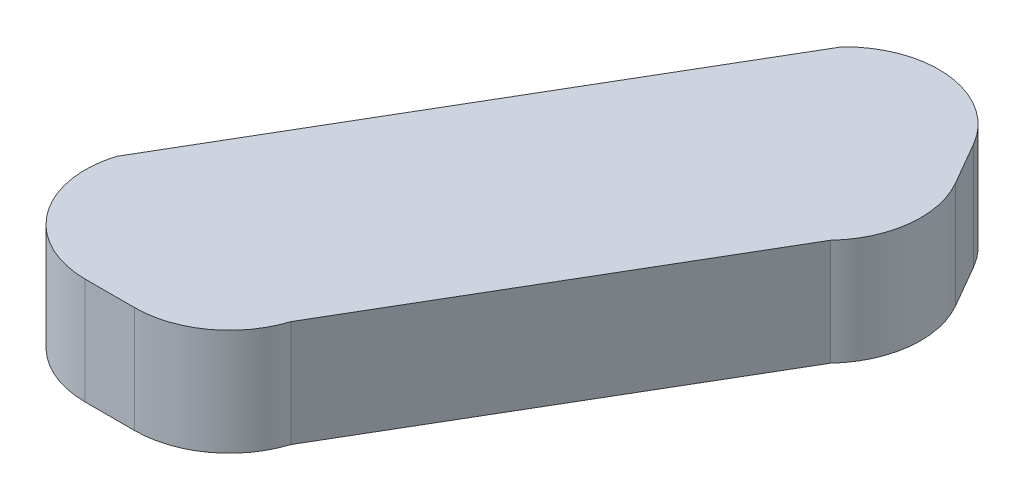
ISO-10303-21;
HEADER;
FILE_DESCRIPTION(('STEP AP214'),'2;1');
FILE_NAME('part.step','',(''),(''),'','','');
FILE_SCHEMA(('AUTOMOTIVE_DESIGN { 1 0 10303 214 1 1 1 1 }'));
ENDSEC;
DATA;
#1=APPLICATION_CONTEXT('core data for automotive mechanical design processes');
#2=APPLICATION_PROTOCOL_DEFINITION('international standard','automotive_design',2000,#1);
#3=PRODUCT_CONTEXT('',#1,'mechanical');
#4=PRODUCT('Part','Part','',(#3));
#5=PRODUCT_RELATED_PRODUCT_CATEGORY('part','',(#4));
#6=PRODUCT_DEFINITION_FORMATION('','',#4);
#7=PRODUCT_DEFINITION_CONTEXT('part definition',#1,'design');
#8=PRODUCT_DEFINITION('design','',#6,#7);
#9=PRODUCT_DEFINITION_SHAPE('','',#8);
#10=(LENGTH_UNIT() NAMED_UNIT(*) SI_UNIT(.MILLI.,.METRE.));
#11=(NAMED_UNIT(*) PLANE_ANGLE_UNIT() SI_UNIT($,.RADIAN.));
#12=(NAMED_UNIT(*) SI_UNIT($,.STERADIAN.) SOLID_ANGLE_UNIT());
#13=UNCERTAINTY_MEASURE_WITH_UNIT(LENGTH_MEASURE(1.E-05),#10,'distance_accuracy_value','');
#14=(GEOMETRIC_REPRESENTATION_CONTEXT(3) GLOBAL_UNCERTAINTY_ASSIGNED_CONTEXT((#13)) GLOBAL_UNIT_ASSIGNED_CONTEXT((#10,
#11,#12)) REPRESENTATION_CONTEXT('',''));
#15=CARTESIAN_POINT('',(0.,0.,0.));
#16=DIRECTION('',(0.,0.,1.));
#17=DIRECTION('',(1.,0.,0.));
#18=AXIS2_PLACEMENT_3D('',#15,#16,#17);
#19=CARTESIAN_POINT('',(-62.5966892851256,4.5,-60.4206462274399));
#20=DIRECTION('',(0.,-1.,0.));
#21=DIRECTION('',(0.,0.,-1.));
#22=AXIS2_PLACEMENT_3D('',#19,#20,#21);
#23=CYLINDRICAL_SURFACE('',#22,8.);
#24=CARTESIAN_POINT('',(-62.5966892851256,-4.5,-60.4206462274399));
#25=DIRECTION('',(0.,1.,0.));
#26=DIRECTION('',(0.,0.,1.));
#27=AXIS2_PLACEMENT_3D('',#24,#25,#26);
#28=CIRCLE('',#27,8.);
#29=CARTESIAN_POINT('',(-55.66848605485,-4.5,-64.4206462274399));
#30=VERTEX_POINT('',#29);
#31=CARTESIAN_POINT('',(-68.3527066906543,-4.5,-65.9765677196183));
#32=VERTEX_POINT('',#31);
#33=EDGE_CURVE('E140',#30,#32,#28,.T.);
#34=ORIENTED_EDGE('',*,*,#33,.T.);
#35=DIRECTION('',(0.,-1.,0.));
#36=VECTOR('',#35,1.);
#37=CARTESIAN_POINT('',(-68.3527066906543,4.5,-65.9765677196183));
#38=LINE('',#37,#36);
#39=CARTESIAN_POINT('',(-68.3527066906543,4.5,-65.9765677196183));
#40=VERTEX_POINT('',#39);
#41=EDGE_CURVE('E11',#40,#32,#38,.T.);
#42=ORIENTED_EDGE('',*,*,#41,.F.);
#43=CARTESIAN_POINT('',(-62.5966892851256,4.5,-60.4206462274399));
#44=DIRECTION('',(0.,1.,0.));
#45=DIRECTION('',(0.,0.,1.));
#46=AXIS2_PLACEMENT_3D('',#43,#44,#45);
#47=CIRCLE('',#46,8.);
#48=CARTESIAN_POINT('',(-55.66848605485,4.5,-64.4206462274399));
#49=VERTEX_POINT('',#48);
#50=EDGE_CURVE('E162',#49,#40,#47,.T.);
#51=ORIENTED_EDGE('',*,*,#50,.F.);
#52=DIRECTION('',(0.,-1.,0.));
#53=VECTOR('',#52,1.);
#54=CARTESIAN_POINT('',(-55.66848605485,4.5,-64.4206462274399));
#55=LINE('',#54,#53);
#56=EDGE_CURVE('E136',#49,#30,#55,.T.);
#57=ORIENTED_EDGE('',*,*,#56,.T.);
#58=EDGE_LOOP('',(#34,#42,#51,#57));
#59=FACE_BOUND('',#58,.T.);
#60=ADVANCED_FACE('F39',(#59),#23,.T.);
#61=CARTESIAN_POINT('',(-68.3527066906543,4.5,-65.9765677196183));
#62=DIRECTION('',(0.863015101140833,0.,0.505178122252813));
#63=DIRECTION('',(0.505178122252813,0.,-0.863015101140833));
#64=AXIS2_PLACEMENT_3D('',#61,#62,#63);
#65=PLANE('',#64);
#66=DIRECTION('',(-0.505178122252813,0.,0.863015101140833));
#67=VECTOR('',#66,1.);
#68=CARTESIAN_POINT('',(-68.3527066906543,-4.5,-65.9765677196183));
#69=LINE('',#68,#67);
#70=CARTESIAN_POINT('',(-90.9932566583893,-4.5,-27.2988505747126));
#71=VERTEX_POINT('',#70);
#72=EDGE_CURVE('E144',#32,#71,#69,.T.);
#73=ORIENTED_EDGE('',*,*,#72,.T.);
#74=DIRECTION('',(0.,-1.,0.));
#75=VECTOR('',#74,1.);
#76=CARTESIAN_POINT('',(-90.9932566583893,4.5,-27.2988505747126));
#77=LINE('',#76,#75);
#78=CARTESIAN_POINT('',(-90.9932566583893,4.5,-27.2988505747126));
#79=VERTEX_POINT('',#78);
#80=EDGE_CURVE('E48',#79,#71,#77,.T.);
#81=ORIENTED_EDGE('',*,*,#80,.F.);
#82=DIRECTION('',(-0.505178122252813,0.,0.863015101140833));
#83=VECTOR('',#82,1.);
#84=CARTESIAN_POINT('',(-68.3527066906543,4.5,-65.9765677196183));
#85=LINE('',#84,#83);
#86=EDGE_CURVE('E99',#40,#79,#85,.T.);
#87=ORIENTED_EDGE('',*,*,#86,.F.);
#88=ORIENTED_EDGE('',*,*,#41,.T.);
#89=EDGE_LOOP('',(#73,#81,#87,#88));
#90=FACE_BOUND('',#89,.T.);
#91=ADVANCED_FACE('F208',(#90),#65,.F.);
#92=CARTESIAN_POINT('',(-83.3306666239986,4.5,-25.));
#93=DIRECTION('',(0.,-1.,0.));
#94=DIRECTION('',(0.,0.,-1.));
#95=AXIS2_PLACEMENT_3D('',#92,#93,#94);
#96=CYLINDRICAL_SURFACE('',#95,8.);
#97=CARTESIAN_POINT('',(-83.3306666239986,-4.5,-25.));
#98=DIRECTION('',(0.,1.,0.));
#99=DIRECTION('',(0.,0.,-1.));
#100=AXIS2_PLACEMENT_3D('',#97,#98,#99);
#101=CIRCLE('',#100,8.);
#102=CARTESIAN_POINT('',(-83.3306666239987,-4.5,-17.));
#103=VERTEX_POINT('',#102);
#104=EDGE_CURVE('E147',#71,#103,#101,.T.);
#105=ORIENTED_EDGE('',*,*,#104,.T.);
#106=DIRECTION('',(0.,-1.,0.));
#107=VECTOR('',#106,1.);
#108=CARTESIAN_POINT('',(-83.3306666239987,4.5,-17.));
#109=LINE('',#108,#107);
#110=CARTESIAN_POINT('',(-83.3306666239987,4.5,-17.));
#111=VERTEX_POINT('',#110);
#112=EDGE_CURVE('E173',#111,#103,#109,.T.);
#113=ORIENTED_EDGE('',*,*,#112,.F.);
#114=CARTESIAN_POINT('',(-83.3306666239986,4.5,-25.));
#115=DIRECTION('',(0.,1.,0.));
#116=DIRECTION('',(0.,0.,-1.));
#117=AXIS2_PLACEMENT_3D('',#114,#115,#116);
#118=CIRCLE('',#117,8.);
#119=EDGE_CURVE('E183',#79,#111,#118,.T.);
#120=ORIENTED_EDGE('',*,*,#119,.F.);
#121=ORIENTED_EDGE('',*,*,#80,.T.);
#122=EDGE_LOOP('',(#105,#113,#120,#121));
#123=FACE_BOUND('',#122,.T.);
#124=ADVANCED_FACE('F181',(#123),#96,.T.);
#125=CARTESIAN_POINT('',(-83.3306666239987,4.5,-17.));
#126=DIRECTION('',(0.,0.,-1.));
#127=DIRECTION('',(-1.,0.,0.));
#128=AXIS2_PLACEMENT_3D('',#125,#126,#127);
#129=PLANE('',#128);
#130=DIRECTION('',(1.,0.,0.));
#131=VECTOR('',#130,1.);
#132=CARTESIAN_POINT('',(-83.3306666239987,-4.5,-17.));
#133=LINE('',#132,#131);
#134=CARTESIAN_POINT('',(-79.1454357496375,-4.5,-17.));
#135=VERTEX_POINT('',#134);
#136=EDGE_CURVE('E150',#103,#135,#133,.T.);
#137=ORIENTED_EDGE('',*,*,#136,.T.);
#138=DIRECTION('',(0.,-1.,0.));
#139=VECTOR('',#138,1.);
#140=CARTESIAN_POINT('',(-79.1454357496375,4.5,-17.));
#141=LINE('',#140,#139);
#142=CARTESIAN_POINT('',(-79.1454357496375,4.5,-17.));
#143=VERTEX_POINT('',#142);
#144=EDGE_CURVE('E169',#143,#135,#141,.T.);
#145=ORIENTED_EDGE('',*,*,#144,.F.);
#146=DIRECTION('',(1.,0.,0.));
#147=VECTOR('',#146,1.);
#148=CARTESIAN_POINT('',(-83.3306666239987,4.5,-17.));
#149=LINE('',#148,#147);
#150=EDGE_CURVE('E196',#111,#143,#149,.T.);
#151=ORIENTED_EDGE('',*,*,#150,.F.);
#152=ORIENTED_EDGE('',*,*,#112,.T.);
#153=EDGE_LOOP('',(#137,#145,#151,#152));
#154=FACE_BOUND('',#153,.T.);
#155=ADVANCED_FACE('F191',(#154),#129,.F.);
#156=CARTESIAN_POINT('',(-79.1454357496375,4.5,-25.));
#157=DIRECTION('',(0.,-1.,0.));
#158=DIRECTION('',(0.,0.,-1.));
#159=AXIS2_PLACEMENT_3D('',#156,#157,#158);
#160=CYLINDRICAL_SURFACE('',#159,8.);
#161=CARTESIAN_POINT('',(-79.1454357496375,-4.5,-25.));
#162=DIRECTION('',(0.,1.,0.));
#163=DIRECTION('',(0.,0.,-1.));
#164=AXIS2_PLACEMENT_3D('',#161,#162,#163);
#165=CIRCLE('',#164,8.);
#166=CARTESIAN_POINT('',(-71.5169600147327,-4.5,-22.5903614457831));
#167=VERTEX_POINT('',#166);
#168=EDGE_CURVE('E153',#135,#167,#165,.T.);
#169=ORIENTED_EDGE('',*,*,#168,.T.);
#170=DIRECTION('',(0.,-1.,0.));
#171=VECTOR('',#170,1.);
#172=CARTESIAN_POINT('',(-71.5169600147327,4.5,-22.5903614457831));
#173=LINE('',#172,#171);
#174=CARTESIAN_POINT('',(-71.5169600147327,4.5,-22.5903614457831));
#175=VERTEX_POINT('',#174);
#176=EDGE_CURVE('E129',#175,#167,#173,.T.);
#177=ORIENTED_EDGE('',*,*,#176,.F.);
#178=CARTESIAN_POINT('',(-79.1454357496375,4.5,-25.));
#179=DIRECTION('',(0.,1.,0.));
#180=DIRECTION('',(0.,0.,-1.));
#181=AXIS2_PLACEMENT_3D('',#178,#179,#180);
#182=CIRCLE('',#181,8.);
#183=EDGE_CURVE('E118',#143,#175,#182,.T.);
#184=ORIENTED_EDGE('',*,*,#183,.F.);
#185=ORIENTED_EDGE('',*,*,#144,.T.);
#186=EDGE_LOOP('',(#169,#177,#184,#185));
#187=FACE_BOUND('',#186,.T.);
#188=ADVANCED_FACE('F194',(#187),#160,.T.);
#189=CARTESIAN_POINT('',(-54.6793413314358,4.5,-51.3339033345442));
#190=DIRECTION('',(-0.862855663834764,0.,-0.505450396565547));
#191=DIRECTION('',(-0.505450396565548,0.,0.862855663834764));
#192=AXIS2_PLACEMENT_3D('',#189,#190,#191);
#193=PLANE('',#192);
#194=DIRECTION('',(0.505450396565548,0.,-0.862855663834764));
#195=VECTOR('',#194,1.);
#196=CARTESIAN_POINT('',(-54.6793413314358,-4.5,-51.3339033345442));
#197=LINE('',#196,#195);
#198=CARTESIAN_POINT('',(-54.6793413314358,-4.5,-51.3339033345442));
#199=VERTEX_POINT('',#198);
#200=EDGE_CURVE('E127',#167,#199,#197,.T.);
#201=ORIENTED_EDGE('',*,*,#200,.T.);
#202=DIRECTION('',(0.,-1.,0.));
#203=VECTOR('',#202,1.);
#204=CARTESIAN_POINT('',(-54.6793413314358,4.5,-51.3339033345442));
#205=LINE('',#204,#203);
#206=CARTESIAN_POINT('',(-54.6793413314358,4.5,-51.3339033345442));
#207=VERTEX_POINT('',#206);
#208=EDGE_CURVE('E124',#207,#199,#205,.T.);
#209=ORIENTED_EDGE('',*,*,#208,.F.);
#210=DIRECTION('',(0.505450396565548,0.,-0.862855663834764));
#211=VECTOR('',#210,1.);
#212=CARTESIAN_POINT('',(-54.6793413314358,4.5,-51.3339033345442));
#213=LINE('',#212,#211);
#214=EDGE_CURVE('E112',#175,#207,#213,.T.);
#215=ORIENTED_EDGE('',*,*,#214,.F.);
#216=ORIENTED_EDGE('',*,*,#176,.T.);
#217=EDGE_LOOP('',(#201,#209,#215,#216));
#218=FACE_BOUND('',#217,.T.);
#219=ADVANCED_FACE('F125',(#218),#193,.F.);
#220=CARTESIAN_POINT('',(-60.511804406789,4.5,-56.8095196902289));
#221=DIRECTION('',(0.,-1.,0.));
#222=DIRECTION('',(0.,0.,-1.));
#223=AXIS2_PLACEMENT_3D('',#220,#221,#222);
#224=CYLINDRICAL_SURFACE('',#223,8.);
#225=CARTESIAN_POINT('',(-60.511804406789,-4.5,-56.8095196902289));
#226=DIRECTION('',(0.,1.,0.));
#227=DIRECTION('',(0.,0.,-1.));
#228=AXIS2_PLACEMENT_3D('',#225,#226,#227);
#229=CIRCLE('',#228,8.);
#230=CARTESIAN_POINT('',(-53.5836011765135,-4.5,-60.8095196902289));
#231=VERTEX_POINT('',#230);
#232=EDGE_CURVE('E85',#199,#231,#229,.T.);
#233=ORIENTED_EDGE('',*,*,#232,.T.);
#234=DIRECTION('',(0.,-1.,0.));
#235=VECTOR('',#234,1.);
#236=CARTESIAN_POINT('',(-53.5836011765135,4.5,-60.8095196902289));
#237=LINE('',#236,#235);
#238=CARTESIAN_POINT('',(-53.5836011765135,4.5,-60.8095196902289));
#239=VERTEX_POINT('',#238);
#240=EDGE_CURVE('E130',#239,#231,#237,.T.);
#241=ORIENTED_EDGE('',*,*,#240,.F.);
#242=CARTESIAN_POINT('',(-60.511804406789,4.5,-56.8095196902289));
#243=DIRECTION('',(0.,1.,0.));
#244=DIRECTION('',(0.,0.,-1.));
#245=AXIS2_PLACEMENT_3D('',#242,#243,#244);
#246=CIRCLE('',#245,8.);
#247=EDGE_CURVE('E116',#207,#239,#246,.T.);
#248=ORIENTED_EDGE('',*,*,#247,.F.);
#249=ORIENTED_EDGE('',*,*,#208,.T.);
#250=EDGE_LOOP('',(#233,#241,#248,#249));
#251=FACE_BOUND('',#250,.T.);
#252=ADVANCED_FACE('F132',(#251),#224,.T.);
#253=CARTESIAN_POINT('',(-53.5836011765135,4.5,-60.8095196902289));
#254=DIRECTION('',(-0.86602540378444,0.,0.499999999999998));
#255=DIRECTION('',(0.499999999999998,0.,0.86602540378444));
#256=AXIS2_PLACEMENT_3D('',#253,#254,#255);
#257=PLANE('',#256);
#258=DIRECTION('',(-0.499999999999998,0.,-0.86602540378444));
#259=VECTOR('',#258,1.);
#260=CARTESIAN_POINT('',(-53.5836011765135,-4.5,-60.8095196902289));
#261=LINE('',#260,#259);
#262=EDGE_CURVE('E91',#231,#30,#261,.T.);
#263=ORIENTED_EDGE('',*,*,#262,.T.);
#264=ORIENTED_EDGE('',*,*,#56,.F.);
#265=DIRECTION('',(-0.499999999999998,0.,-0.86602540378444));
#266=VECTOR('',#265,1.);
#267=CARTESIAN_POINT('',(-53.5836011765135,4.5,-60.8095196902289));
#268=LINE('',#267,#266);
#269=EDGE_CURVE('E56',#239,#49,#268,.T.);
#270=ORIENTED_EDGE('',*,*,#269,.F.);
#271=ORIENTED_EDGE('',*,*,#240,.T.);
#272=EDGE_LOOP('',(#263,#264,#270,#271));
#273=FACE_BOUND('',#272,.T.);
#274=ADVANCED_FACE('F224',(#273),#257,.F.);
#275=CARTESIAN_POINT('',(-62.5966892851256,4.5,-60.4206462274399));
#276=DIRECTION('',(0.,1.,0.));
#277=DIRECTION('',(0.,0.,1.));
#278=AXIS2_PLACEMENT_3D('',#275,#276,#277);
#279=PLANE('',#278);
#280=ORIENTED_EDGE('',*,*,#50,.T.);
#281=ORIENTED_EDGE('',*,*,#86,.T.);
#282=ORIENTED_EDGE('',*,*,#119,.T.);
#283=ORIENTED_EDGE('',*,*,#150,.T.);
#284=ORIENTED_EDGE('',*,*,#183,.T.);
#285=ORIENTED_EDGE('',*,*,#214,.T.);
#286=ORIENTED_EDGE('',*,*,#247,.T.);
#287=ORIENTED_EDGE('',*,*,#269,.T.);
#288=EDGE_LOOP('',(#280,#281,#282,#283,#284,#285,#286,#287));
#289=FACE_BOUND('',#288,.T.);
#290=ADVANCED_FACE('F114',(#289),#279,.T.);
#291=CARTESIAN_POINT('',(-62.5966892851256,-4.5,-60.4206462274399));
#292=DIRECTION('',(0.,1.,0.));
#293=DIRECTION('',(0.,0.,1.));
#294=AXIS2_PLACEMENT_3D('',#291,#292,#293);
#295=PLANE('',#294);
#296=ORIENTED_EDGE('',*,*,#33,.F.);
#297=ORIENTED_EDGE('',*,*,#262,.F.);
#298=ORIENTED_EDGE('',*,*,#232,.F.);
#299=ORIENTED_EDGE('',*,*,#200,.F.);
#300=ORIENTED_EDGE('',*,*,#168,.F.);
#301=ORIENTED_EDGE('',*,*,#136,.F.);
#302=ORIENTED_EDGE('',*,*,#104,.F.);
#303=ORIENTED_EDGE('',*,*,#72,.F.);
#304=EDGE_LOOP('',(#296,#297,#298,#299,#300,#301,#302,#303));
#305=FACE_BOUND('',#304,.T.);
#306=ADVANCED_FACE('F187',(#305),#295,.F.);
#307=CLOSED_SHELL('',(#60,#91,#124,#155,#188,#219,#252,#274,#290,#306));
#308=MANIFOLD_SOLID_BREP('B2',#307);
#309=ADVANCED_BREP_SHAPE_REPRESENTATION('',(#18,#308),#14);
#310=SHAPE_DEFINITION_REPRESENTATION(#9,#309);
ENDSEC;
END-ISO-10303-21;
